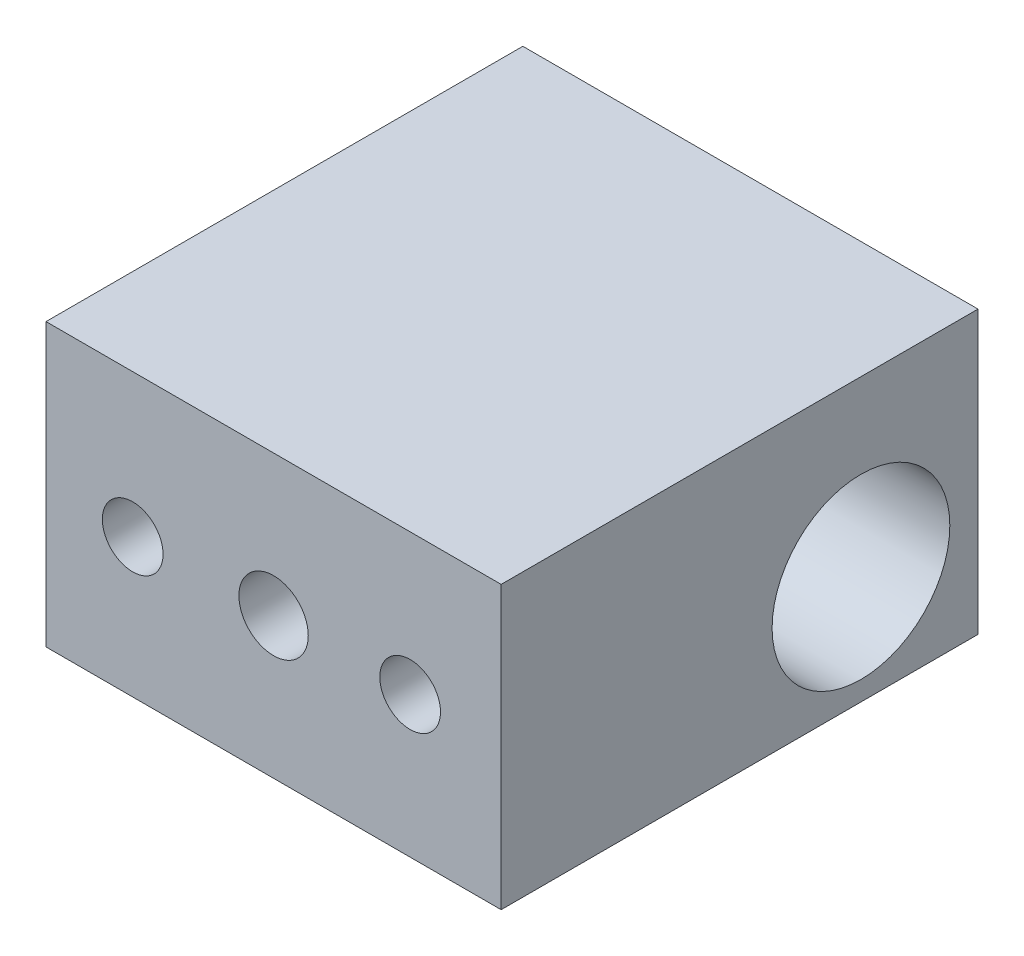
ISO-10303-21;
HEADER;
FILE_DESCRIPTION(('STEP AP214'),'2;1');
FILE_NAME('part.step','',(''),(''),'','','');
FILE_SCHEMA(('AUTOMOTIVE_DESIGN { 1 0 10303 214 1 1 1 1 }'));
ENDSEC;
DATA;
#1=APPLICATION_CONTEXT('core data for automotive mechanical design processes');
#2=APPLICATION_PROTOCOL_DEFINITION('international standard','automotive_design',2000,#1);
#3=PRODUCT_CONTEXT('',#1,'mechanical');
#4=PRODUCT('Part','Part','',(#3));
#5=PRODUCT_RELATED_PRODUCT_CATEGORY('part','',(#4));
#6=PRODUCT_DEFINITION_FORMATION('','',#4);
#7=PRODUCT_DEFINITION_CONTEXT('part definition',#1,'design');
#8=PRODUCT_DEFINITION('design','',#6,#7);
#9=PRODUCT_DEFINITION_SHAPE('','',#8);
#10=(LENGTH_UNIT() NAMED_UNIT(*) SI_UNIT(.MILLI.,.METRE.));
#11=(NAMED_UNIT(*) PLANE_ANGLE_UNIT() SI_UNIT($,.RADIAN.));
#12=(NAMED_UNIT(*) SI_UNIT($,.STERADIAN.) SOLID_ANGLE_UNIT());
#13=UNCERTAINTY_MEASURE_WITH_UNIT(LENGTH_MEASURE(1.E-05),#10,'distance_accuracy_value','');
#14=(GEOMETRIC_REPRESENTATION_CONTEXT(3) GLOBAL_UNCERTAINTY_ASSIGNED_CONTEXT((#13)) GLOBAL_UNIT_ASSIGNED_CONTEXT((#10,
#11,#12)) REPRESENTATION_CONTEXT('',''));
#15=CARTESIAN_POINT('',(0.,0.,0.));
#16=DIRECTION('',(0.,0.,1.));
#17=DIRECTION('',(1.,0.,0.));
#18=AXIS2_PLACEMENT_3D('',#15,#16,#17);
#19=CARTESIAN_POINT('',(52.5,32.5,-110.));
#20=DIRECTION('',(1.,0.,0.));
#21=DIRECTION('',(0.,1.,0.));
#22=AXIS2_PLACEMENT_3D('',#19,#20,#21);
#23=PLANE('',#22);
#24=CARTESIAN_POINT('',(52.5,-7.5,-83.));
#25=DIRECTION('',(1.,0.,0.));
#26=DIRECTION('',(0.,1.,0.));
#27=AXIS2_PLACEMENT_3D('',#24,#25,#26);
#28=CIRCLE('',#27,20.5);
#29=CARTESIAN_POINT('',(52.5,13.,-83.));
#30=VERTEX_POINT('',#29);
#31=EDGE_CURVE('E170',#30,#30,#28,.T.);
#32=ORIENTED_EDGE('',*,*,#31,.F.);
#33=EDGE_LOOP('',(#32));
#34=FACE_BOUND('',#33,.T.);
#35=DIRECTION('',(0.,1.,0.));
#36=VECTOR('',#35,1.);
#37=CARTESIAN_POINT('',(52.5,32.5,0.));
#38=LINE('',#37,#36);
#39=CARTESIAN_POINT('',(52.5,-32.5,0.));
#40=VERTEX_POINT('',#39);
#41=CARTESIAN_POINT('',(52.5,32.5,0.));
#42=VERTEX_POINT('',#41);
#43=EDGE_CURVE('E103',#40,#42,#38,.T.);
#44=ORIENTED_EDGE('',*,*,#43,.F.);
#45=DIRECTION('',(0.,0.,1.));
#46=VECTOR('',#45,1.);
#47=CARTESIAN_POINT('',(52.5,-32.5,-110.));
#48=LINE('',#47,#46);
#49=CARTESIAN_POINT('',(52.5,-32.5,-110.));
#50=VERTEX_POINT('',#49);
#51=EDGE_CURVE('E11',#50,#40,#48,.T.);
#52=ORIENTED_EDGE('',*,*,#51,.F.);
#53=DIRECTION('',(0.,1.,0.));
#54=VECTOR('',#53,1.);
#55=CARTESIAN_POINT('',(52.5,32.5,-110.));
#56=LINE('',#55,#54);
#57=CARTESIAN_POINT('',(52.5,32.5,-110.));
#58=VERTEX_POINT('',#57);
#59=EDGE_CURVE('E96',#50,#58,#56,.T.);
#60=ORIENTED_EDGE('',*,*,#59,.T.);
#61=DIRECTION('',(0.,0.,1.));
#62=VECTOR('',#61,1.);
#63=CARTESIAN_POINT('',(52.5,32.5,-110.));
#64=LINE('',#63,#62);
#65=EDGE_CURVE('E41',#58,#42,#64,.T.);
#66=ORIENTED_EDGE('',*,*,#65,.T.);
#67=EDGE_LOOP('',(#44,#52,#60,#66));
#68=FACE_BOUND('',#67,.T.);
#69=ADVANCED_FACE('F38',(#34,#68),#23,.T.);
#70=CARTESIAN_POINT('',(-52.5,-32.5,-110.));
#71=DIRECTION('',(0.,-1.,0.));
#72=DIRECTION('',(0.,0.,-1.));
#73=AXIS2_PLACEMENT_3D('',#70,#71,#72);
#74=PLANE('',#73);
#75=DIRECTION('',(1.,0.,0.));
#76=VECTOR('',#75,1.);
#77=CARTESIAN_POINT('',(-52.5,-32.5,0.));
#78=LINE('',#77,#76);
#79=CARTESIAN_POINT('',(-52.5,-32.5,0.));
#80=VERTEX_POINT('',#79);
#81=EDGE_CURVE('E98',#80,#40,#78,.T.);
#82=ORIENTED_EDGE('',*,*,#81,.F.);
#83=DIRECTION('',(0.,0.,1.));
#84=VECTOR('',#83,1.);
#85=CARTESIAN_POINT('',(-52.5,-32.5,-110.));
#86=LINE('',#85,#84);
#87=CARTESIAN_POINT('',(-52.5,-32.5,-110.));
#88=VERTEX_POINT('',#87);
#89=EDGE_CURVE('E47',#88,#80,#86,.T.);
#90=ORIENTED_EDGE('',*,*,#89,.F.);
#91=DIRECTION('',(1.,0.,0.));
#92=VECTOR('',#91,1.);
#93=CARTESIAN_POINT('',(-52.5,-32.5,-110.));
#94=LINE('',#93,#92);
#95=EDGE_CURVE('E93',#88,#50,#94,.T.);
#96=ORIENTED_EDGE('',*,*,#95,.T.);
#97=ORIENTED_EDGE('',*,*,#51,.T.);
#98=EDGE_LOOP('',(#82,#90,#96,#97));
#99=FACE_BOUND('',#98,.T.);
#100=ADVANCED_FACE('F114',(#99),#74,.T.);
#101=CARTESIAN_POINT('',(-52.5,32.5,-110.));
#102=DIRECTION('',(-1.,0.,0.));
#103=DIRECTION('',(0.,-1.,0.));
#104=AXIS2_PLACEMENT_3D('',#101,#102,#103);
#105=PLANE('',#104);
#106=CARTESIAN_POINT('',(-52.5,-7.50000000000002,-83.));
#107=DIRECTION('',(1.,0.,0.));
#108=DIRECTION('',(0.,1.,0.));
#109=AXIS2_PLACEMENT_3D('',#106,#107,#108);
#110=CIRCLE('',#109,20.5);
#111=CARTESIAN_POINT('',(-52.5,13.,-83.));
#112=VERTEX_POINT('',#111);
#113=EDGE_CURVE('E167',#112,#112,#110,.T.);
#114=ORIENTED_EDGE('',*,*,#113,.T.);
#115=EDGE_LOOP('',(#114));
#116=FACE_BOUND('',#115,.T.);
#117=DIRECTION('',(0.,-1.,0.));
#118=VECTOR('',#117,1.);
#119=CARTESIAN_POINT('',(-52.5,32.5,0.));
#120=LINE('',#119,#118);
#121=CARTESIAN_POINT('',(-52.5,32.5,0.));
#122=VERTEX_POINT('',#121);
#123=EDGE_CURVE('E88',#122,#80,#120,.T.);
#124=ORIENTED_EDGE('',*,*,#123,.F.);
#125=DIRECTION('',(0.,0.,1.));
#126=VECTOR('',#125,1.);
#127=CARTESIAN_POINT('',(-52.5,32.5,-110.));
#128=LINE('',#127,#126);
#129=CARTESIAN_POINT('',(-52.5,32.5,-110.));
#130=VERTEX_POINT('',#129);
#131=EDGE_CURVE('E83',#130,#122,#128,.T.);
#132=ORIENTED_EDGE('',*,*,#131,.F.);
#133=DIRECTION('',(0.,-1.,0.));
#134=VECTOR('',#133,1.);
#135=CARTESIAN_POINT('',(-52.5,32.5,-110.));
#136=LINE('',#135,#134);
#137=EDGE_CURVE('E86',#130,#88,#136,.T.);
#138=ORIENTED_EDGE('',*,*,#137,.T.);
#139=ORIENTED_EDGE('',*,*,#89,.T.);
#140=EDGE_LOOP('',(#124,#132,#138,#139));
#141=FACE_BOUND('',#140,.T.);
#142=ADVANCED_FACE('F85',(#116,#141),#105,.T.);
#143=CARTESIAN_POINT('',(-52.5,32.5,-110.));
#144=DIRECTION('',(0.,1.,0.));
#145=DIRECTION('',(0.,0.,1.));
#146=AXIS2_PLACEMENT_3D('',#143,#144,#145);
#147=PLANE('',#146);
#148=DIRECTION('',(-1.,0.,0.));
#149=VECTOR('',#148,1.);
#150=CARTESIAN_POINT('',(-52.5,32.5,0.));
#151=LINE('',#150,#149);
#152=EDGE_CURVE('E106',#42,#122,#151,.T.);
#153=ORIENTED_EDGE('',*,*,#152,.F.);
#154=ORIENTED_EDGE('',*,*,#65,.F.);
#155=DIRECTION('',(-1.,0.,0.));
#156=VECTOR('',#155,1.);
#157=CARTESIAN_POINT('',(-52.5,32.5,-110.));
#158=LINE('',#157,#156);
#159=EDGE_CURVE('E92',#58,#130,#158,.T.);
#160=ORIENTED_EDGE('',*,*,#159,.T.);
#161=ORIENTED_EDGE('',*,*,#131,.T.);
#162=EDGE_LOOP('',(#153,#154,#160,#161));
#163=FACE_BOUND('',#162,.T.);
#164=ADVANCED_FACE('F95',(#163),#147,.T.);
#165=CARTESIAN_POINT('',(0.,0.,-110.));
#166=DIRECTION('',(0.,0.,1.));
#167=DIRECTION('',(1.,0.,0.));
#168=AXIS2_PLACEMENT_3D('',#165,#166,#167);
#169=PLANE('',#168);
#170=ORIENTED_EDGE('',*,*,#59,.F.);
#171=ORIENTED_EDGE('',*,*,#95,.F.);
#172=ORIENTED_EDGE('',*,*,#137,.F.);
#173=ORIENTED_EDGE('',*,*,#159,.F.);
#174=EDGE_LOOP('',(#170,#171,#172,#173));
#175=FACE_BOUND('',#174,.T.);
#176=ADVANCED_FACE('F91',(#175),#169,.F.);
#177=CARTESIAN_POINT('',(0.,0.,0.));
#178=DIRECTION('',(0.,0.,1.));
#179=DIRECTION('',(1.,0.,0.));
#180=AXIS2_PLACEMENT_3D('',#177,#178,#179);
#181=PLANE('',#180);
#182=CARTESIAN_POINT('',(-32.5,-0.5,0.));
#183=DIRECTION('',(0.,0.,1.));
#184=DIRECTION('',(1.,0.,0.));
#185=AXIS2_PLACEMENT_3D('',#182,#183,#184);
#186=CIRCLE('',#185,7.);
#187=CARTESIAN_POINT('',(-25.5,-0.5,0.));
#188=VERTEX_POINT('',#187);
#189=EDGE_CURVE('E177',#188,#188,#186,.T.);
#190=ORIENTED_EDGE('',*,*,#189,.F.);
#191=EDGE_LOOP('',(#190));
#192=FACE_BOUND('',#191,.T.);
#193=CARTESIAN_POINT('',(31.5,0.,0.));
#194=DIRECTION('',(0.,0.,1.));
#195=DIRECTION('',(1.,0.,0.));
#196=AXIS2_PLACEMENT_3D('',#193,#194,#195);
#197=CIRCLE('',#196,7.);
#198=CARTESIAN_POINT('',(38.5,0.,0.));
#199=VERTEX_POINT('',#198);
#200=EDGE_CURVE('E183',#199,#199,#197,.T.);
#201=ORIENTED_EDGE('',*,*,#200,.F.);
#202=EDGE_LOOP('',(#201));
#203=FACE_BOUND('',#202,.T.);
#204=CARTESIAN_POINT('',(0.,0.,0.));
#205=DIRECTION('',(0.,0.,1.));
#206=DIRECTION('',(1.,0.,0.));
#207=AXIS2_PLACEMENT_3D('',#204,#205,#206);
#208=CIRCLE('',#207,8.);
#209=CARTESIAN_POINT('',(8.,0.,0.));
#210=VERTEX_POINT('',#209);
#211=EDGE_CURVE('E172',#210,#210,#208,.T.);
#212=ORIENTED_EDGE('',*,*,#211,.F.);
#213=EDGE_LOOP('',(#212));
#214=FACE_BOUND('',#213,.T.);
#215=ORIENTED_EDGE('',*,*,#43,.T.);
#216=ORIENTED_EDGE('',*,*,#152,.T.);
#217=ORIENTED_EDGE('',*,*,#123,.T.);
#218=ORIENTED_EDGE('',*,*,#81,.T.);
#219=EDGE_LOOP('',(#215,#216,#217,#218));
#220=FACE_BOUND('',#219,.T.);
#221=ADVANCED_FACE('F113',(#192,#203,#214,#220),#181,.T.);
#222=CARTESIAN_POINT('',(0.,0.,-50.));
#223=DIRECTION('',(0.,0.,1.));
#224=DIRECTION('',(1.,0.,0.));
#225=AXIS2_PLACEMENT_3D('',#222,#223,#224);
#226=CYLINDRICAL_SURFACE('',#225,8.);
#227=CARTESIAN_POINT('',(0.,0.,-50.));
#228=DIRECTION('',(0.,0.,1.));
#229=DIRECTION('',(1.,0.,0.));
#230=AXIS2_PLACEMENT_3D('',#227,#228,#229);
#231=CIRCLE('',#230,8.);
#232=CARTESIAN_POINT('',(8.,0.,-50.));
#233=VERTEX_POINT('',#232);
#234=EDGE_CURVE('E186',#233,#233,#231,.T.);
#235=ORIENTED_EDGE('',*,*,#234,.F.);
#236=EDGE_LOOP('',(#235));
#237=FACE_BOUND('',#236,.T.);
#238=ORIENTED_EDGE('',*,*,#211,.T.);
#239=EDGE_LOOP('',(#238));
#240=FACE_BOUND('',#239,.T.);
#241=ADVANCED_FACE('F133',(#237,#240),#226,.F.);
#242=CARTESIAN_POINT('',(0.,0.,-50.));
#243=DIRECTION('',(0.,0.,1.));
#244=DIRECTION('',(1.,0.,0.));
#245=AXIS2_PLACEMENT_3D('',#242,#243,#244);
#246=PLANE('',#245);
#247=ORIENTED_EDGE('',*,*,#234,.T.);
#248=EDGE_LOOP('',(#247));
#249=FACE_BOUND('',#248,.T.);
#250=ADVANCED_FACE('F138',(#249),#246,.T.);
#251=CARTESIAN_POINT('',(31.5,0.,-50.));
#252=DIRECTION('',(0.,0.,1.));
#253=DIRECTION('',(1.,0.,0.));
#254=AXIS2_PLACEMENT_3D('',#251,#252,#253);
#255=CYLINDRICAL_SURFACE('',#254,7.);
#256=CARTESIAN_POINT('',(31.5,0.,-50.));
#257=DIRECTION('',(0.,0.,1.));
#258=DIRECTION('',(1.,0.,0.));
#259=AXIS2_PLACEMENT_3D('',#256,#257,#258);
#260=CIRCLE('',#259,7.);
#261=CARTESIAN_POINT('',(38.5,0.,-50.));
#262=VERTEX_POINT('',#261);
#263=EDGE_CURVE('E180',#262,#262,#260,.T.);
#264=ORIENTED_EDGE('',*,*,#263,.F.);
#265=EDGE_LOOP('',(#264));
#266=FACE_BOUND('',#265,.T.);
#267=ORIENTED_EDGE('',*,*,#200,.T.);
#268=EDGE_LOOP('',(#267));
#269=FACE_BOUND('',#268,.T.);
#270=ADVANCED_FACE('F142',(#266,#269),#255,.F.);
#271=CARTESIAN_POINT('',(0.,0.,-50.));
#272=DIRECTION('',(0.,0.,1.));
#273=DIRECTION('',(1.,0.,0.));
#274=AXIS2_PLACEMENT_3D('',#271,#272,#273);
#275=PLANE('',#274);
#276=ORIENTED_EDGE('',*,*,#263,.T.);
#277=EDGE_LOOP('',(#276));
#278=FACE_BOUND('',#277,.T.);
#279=ADVANCED_FACE('F146',(#278),#275,.T.);
#280=CARTESIAN_POINT('',(-32.5,-0.5,-50.));
#281=DIRECTION('',(0.,0.,1.));
#282=DIRECTION('',(1.,0.,0.));
#283=AXIS2_PLACEMENT_3D('',#280,#281,#282);
#284=CYLINDRICAL_SURFACE('',#283,7.);
#285=CARTESIAN_POINT('',(-32.5,-0.5,-50.));
#286=DIRECTION('',(0.,0.,1.));
#287=DIRECTION('',(1.,0.,0.));
#288=AXIS2_PLACEMENT_3D('',#285,#286,#287);
#289=CIRCLE('',#288,7.);
#290=CARTESIAN_POINT('',(-25.5,-0.5,-50.));
#291=VERTEX_POINT('',#290);
#292=EDGE_CURVE('E107',#291,#291,#289,.T.);
#293=ORIENTED_EDGE('',*,*,#292,.F.);
#294=EDGE_LOOP('',(#293));
#295=FACE_BOUND('',#294,.T.);
#296=ORIENTED_EDGE('',*,*,#189,.T.);
#297=EDGE_LOOP('',(#296));
#298=FACE_BOUND('',#297,.T.);
#299=ADVANCED_FACE('F150',(#295,#298),#284,.F.);
#300=CARTESIAN_POINT('',(0.,0.,-50.));
#301=DIRECTION('',(0.,0.,1.));
#302=DIRECTION('',(1.,0.,0.));
#303=AXIS2_PLACEMENT_3D('',#300,#301,#302);
#304=PLANE('',#303);
#305=ORIENTED_EDGE('',*,*,#292,.T.);
#306=EDGE_LOOP('',(#305));
#307=FACE_BOUND('',#306,.T.);
#308=ADVANCED_FACE('F154',(#307),#304,.T.);
#309=CARTESIAN_POINT('',(-52.5,-7.50000000000002,-83.));
#310=DIRECTION('',(1.,0.,0.));
#311=DIRECTION('',(0.,1.,0.));
#312=AXIS2_PLACEMENT_3D('',#309,#310,#311);
#313=CYLINDRICAL_SURFACE('',#312,20.5);
#314=ORIENTED_EDGE('',*,*,#113,.F.);
#315=EDGE_LOOP('',(#314));
#316=FACE_BOUND('',#315,.T.);
#317=ORIENTED_EDGE('',*,*,#31,.T.);
#318=EDGE_LOOP('',(#317));
#319=FACE_BOUND('',#318,.T.);
#320=ADVANCED_FACE('F158',(#316,#319),#313,.F.);
#321=CLOSED_SHELL('',(#69,#100,#142,#164,#176,#221,#241,#250,#270,#279,#299,#308,#320));
#322=MANIFOLD_SOLID_BREP('B2',#321);
#323=ADVANCED_BREP_SHAPE_REPRESENTATION('',(#18,#322),#14);
#324=SHAPE_DEFINITION_REPRESENTATION(#9,#323);
ENDSEC;
END-ISO-10303-21;
